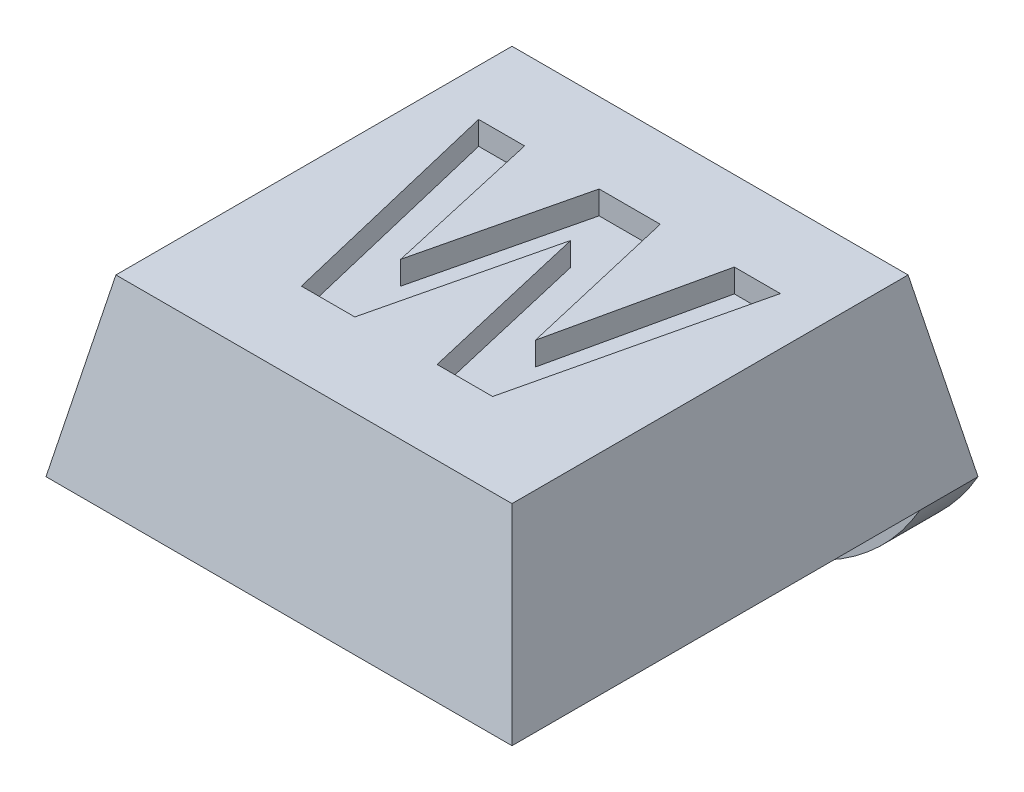
ISO-10303-21;
HEADER;
FILE_DESCRIPTION(('STEP AP214'),'2;1');
FILE_NAME('part.step','',(''),(''),'','','');
FILE_SCHEMA(('AUTOMOTIVE_DESIGN { 1 0 10303 214 1 1 1 1 }'));
ENDSEC;
DATA;
#1=APPLICATION_CONTEXT('core data for automotive mechanical design processes');
#2=APPLICATION_PROTOCOL_DEFINITION('international standard','automotive_design',2000,#1);
#3=PRODUCT_CONTEXT('',#1,'mechanical');
#4=PRODUCT('Part','Part','',(#3));
#5=PRODUCT_RELATED_PRODUCT_CATEGORY('part','',(#4));
#6=PRODUCT_DEFINITION_FORMATION('','',#4);
#7=PRODUCT_DEFINITION_CONTEXT('part definition',#1,'design');
#8=PRODUCT_DEFINITION('design','',#6,#7);
#9=PRODUCT_DEFINITION_SHAPE('','',#8);
#10=(LENGTH_UNIT() NAMED_UNIT(*) SI_UNIT(.MILLI.,.METRE.));
#11=(NAMED_UNIT(*) PLANE_ANGLE_UNIT() SI_UNIT($,.RADIAN.));
#12=(NAMED_UNIT(*) SI_UNIT($,.STERADIAN.) SOLID_ANGLE_UNIT());
#13=UNCERTAINTY_MEASURE_WITH_UNIT(LENGTH_MEASURE(1.E-05),#10,'distance_accuracy_value','');
#14=(GEOMETRIC_REPRESENTATION_CONTEXT(3) GLOBAL_UNCERTAINTY_ASSIGNED_CONTEXT((#13)) GLOBAL_UNIT_ASSIGNED_CONTEXT((#10,
#11,#12)) REPRESENTATION_CONTEXT('',''));
#15=CARTESIAN_POINT('',(0.,0.,0.));
#16=DIRECTION('',(0.,0.,1.));
#17=DIRECTION('',(1.,0.,0.));
#18=AXIS2_PLACEMENT_3D('',#15,#16,#17);
#19=CARTESIAN_POINT('',(0.,3.,0.));
#20=DIRECTION('',(0.,-1.,0.));
#21=DIRECTION('',(0.,0.,-1.));
#22=AXIS2_PLACEMENT_3D('',#19,#20,#21);
#23=PLANE('',#22);
#24=DIRECTION('',(-1.,0.,0.));
#25=VECTOR('',#24,1.);
#26=CARTESIAN_POINT('',(11.,3.,-0.6));
#27=LINE('',#26,#25);
#28=CARTESIAN_POINT('',(7.4,3.,-0.6));
#29=VERTEX_POINT('',#28);
#30=CARTESIAN_POINT('',(0.6,3.,-0.6));
#31=VERTEX_POINT('',#30);
#32=EDGE_CURVE('E235',#29,#31,#27,.T.);
#33=ORIENTED_EDGE('',*,*,#32,.F.);
#34=DIRECTION('',(0.,0.,1.));
#35=VECTOR('',#34,1.);
#36=CARTESIAN_POINT('',(7.4,3.,-8.));
#37=LINE('',#36,#35);
#38=CARTESIAN_POINT('',(7.4,3.,-7.4));
#39=VERTEX_POINT('',#38);
#40=EDGE_CURVE('E248',#39,#29,#37,.T.);
#41=ORIENTED_EDGE('',*,*,#40,.F.);
#42=DIRECTION('',(-1.,0.,0.));
#43=VECTOR('',#42,1.);
#44=CARTESIAN_POINT('',(11.,3.,-7.4));
#45=LINE('',#44,#43);
#46=CARTESIAN_POINT('',(0.599999999999999,3.,-7.4));
#47=VERTEX_POINT('',#46);
#48=EDGE_CURVE('E231',#39,#47,#45,.T.);
#49=ORIENTED_EDGE('',*,*,#48,.T.);
#50=DIRECTION('',(0.,0.,1.));
#51=VECTOR('',#50,1.);
#52=CARTESIAN_POINT('',(0.6,3.,-8.));
#53=LINE('',#52,#51);
#54=EDGE_CURVE('E251',#47,#31,#53,.T.);
#55=ORIENTED_EDGE('',*,*,#54,.T.);
#56=EDGE_LOOP('',(#33,#41,#49,#55));
#57=FACE_BOUND('',#56,.T.);
#58=DIRECTION('',(-1.,0.,0.));
#59=VECTOR('',#58,1.);
#60=CARTESIAN_POINT('',(3.27563446302178,3.,-2.02598897103474));
#61=LINE('',#60,#59);
#62=CARTESIAN_POINT('',(3.27563446302178,3.,-2.02598897103474));
#63=VERTEX_POINT('',#62);
#64=CARTESIAN_POINT('',(2.35896779635511,3.,-2.02598897103474));
#65=VERTEX_POINT('',#64);
#66=EDGE_CURVE('E58',#63,#65,#61,.T.);
#67=ORIENTED_EDGE('',*,*,#66,.T.);
#68=DIRECTION('',(-0.232805557977594,0.,-0.972523301610168));
#69=VECTOR('',#68,1.);
#70=CARTESIAN_POINT('',(2.35896779635511,3.,-2.02598897103474));
#71=LINE('',#70,#69);
#72=CARTESIAN_POINT('',(1.40143574507306,3.,-6.02598897103474));
#73=VERTEX_POINT('',#72);
#74=EDGE_CURVE('E203',#65,#73,#71,.T.);
#75=ORIENTED_EDGE('',*,*,#74,.T.);
#76=DIRECTION('',(1.,0.,0.));
#77=VECTOR('',#76,1.);
#78=CARTESIAN_POINT('',(1.40143574507306,3.,-6.02598897103474));
#79=LINE('',#78,#77);
#80=CARTESIAN_POINT('',(2.1898972835346,3.,-6.02598897103474));
#81=VERTEX_POINT('',#80);
#82=EDGE_CURVE('E687',#73,#81,#79,.T.);
#83=ORIENTED_EDGE('',*,*,#82,.T.);
#84=DIRECTION('',(0.220723550534742,0.,0.975336410803645));
#85=VECTOR('',#84,1.);
#86=CARTESIAN_POINT('',(2.1898972835346,3.,-6.02598897103474));
#87=LINE('',#86,#85);
#88=CARTESIAN_POINT('',(2.81169215532947,3.,-3.27839281718859));
#89=VERTEX_POINT('',#88);
#90=EDGE_CURVE('E689',#81,#89,#87,.T.);
#91=ORIENTED_EDGE('',*,*,#90,.T.);
#92=DIRECTION('',(0.232847309499335,0.,-0.972513306057516));
#93=VECTOR('',#92,1.);
#94=CARTESIAN_POINT('',(2.81169215532947,3.,-3.27839281718859));
#95=LINE('',#94,#93);
#96=CARTESIAN_POINT('',(3.46954471943203,3.,-6.02598897103474));
#97=VERTEX_POINT('',#96);
#98=EDGE_CURVE('E694',#89,#97,#95,.T.);
#99=ORIENTED_EDGE('',*,*,#98,.T.);
#100=DIRECTION('',(1.,0.,0.));
#101=VECTOR('',#100,1.);
#102=CARTESIAN_POINT('',(3.46954471943203,3.,-6.02598897103474));
#103=LINE('',#102,#101);
#104=CARTESIAN_POINT('',(4.51922420661152,3.,-6.02598897103474));
#105=VERTEX_POINT('',#104);
#106=EDGE_CURVE('E704',#97,#105,#103,.T.);
#107=ORIENTED_EDGE('',*,*,#106,.T.);
#108=DIRECTION('',(0.227061862326247,0.,0.973880336939265));
#109=VECTOR('',#108,1.);
#110=CARTESIAN_POINT('',(4.51922420661152,3.,-6.02598897103474));
#111=LINE('',#110,#109);
#112=CARTESIAN_POINT('',(5.17066651430383,3.,-3.23191845821423));
#113=VERTEX_POINT('',#112);
#114=EDGE_CURVE('E708',#105,#113,#111,.T.);
#115=ORIENTED_EDGE('',*,*,#114,.T.);
#116=DIRECTION('',(0.21669330416257,0.,-0.976239730768579));
#117=VECTOR('',#116,1.);
#118=CARTESIAN_POINT('',(5.17066651430383,3.,-3.23191845821423));
#119=LINE('',#118,#117);
#120=CARTESIAN_POINT('',(5.79085882199614,3.,-6.02598897103474));
#121=VERTEX_POINT('',#120);
#122=EDGE_CURVE('E712',#113,#121,#119,.T.);
#123=ORIENTED_EDGE('',*,*,#122,.T.);
#124=DIRECTION('',(1.,0.,0.));
#125=VECTOR('',#124,1.);
#126=CARTESIAN_POINT('',(5.79085882199614,3.,-6.02598897103474));
#127=LINE('',#126,#125);
#128=CARTESIAN_POINT('',(6.58092292456024,3.,-6.02598897103474));
#129=VERTEX_POINT('',#128);
#130=EDGE_CURVE('E716',#121,#129,#127,.T.);
#131=ORIENTED_EDGE('',*,*,#130,.T.);
#132=DIRECTION('',(-0.228745850379276,0.,0.973486176550167));
#133=VECTOR('',#132,1.);
#134=CARTESIAN_POINT('',(6.58092292456024,3.,-6.02598897103474));
#135=LINE('',#134,#133);
#136=CARTESIAN_POINT('',(5.64101907840639,3.,-2.02598897103474));
#137=VERTEX_POINT('',#136);
#138=EDGE_CURVE('E650',#129,#137,#135,.T.);
#139=ORIENTED_EDGE('',*,*,#138,.T.);
#140=DIRECTION('',(-1.,0.,0.));
#141=VECTOR('',#140,1.);
#142=CARTESIAN_POINT('',(5.64101907840639,3.,-2.02598897103474));
#143=LINE('',#142,#141);
#144=CARTESIAN_POINT('',(4.68829471943203,3.,-2.02598897103474));
#145=VERTEX_POINT('',#144);
#146=EDGE_CURVE('E645',#137,#145,#143,.T.);
#147=ORIENTED_EDGE('',*,*,#146,.T.);
#148=DIRECTION('',(-0.227031625408111,0.,-0.973887386233414));
#149=VECTOR('',#148,1.);
#150=CARTESIAN_POINT('',(4.68829471943203,3.,-2.02598897103474));
#151=LINE('',#150,#149);
#152=CARTESIAN_POINT('',(3.99117933481665,3.,-5.01637358641936));
#153=VERTEX_POINT('',#152);
#154=EDGE_CURVE('E639',#145,#153,#151,.T.);
#155=ORIENTED_EDGE('',*,*,#154,.T.);
#156=DIRECTION('',(-0.232712537268101,0.,0.972545564484381));
#157=VECTOR('',#156,1.);
#158=CARTESIAN_POINT('',(3.99117933481665,3.,-5.01637358641936));
#159=LINE('',#158,#157);
#160=EDGE_CURVE('E199',#153,#63,#159,.T.);
#161=ORIENTED_EDGE('',*,*,#160,.T.);
#162=EDGE_LOOP('',(#67,#75,#83,#91,#99,#107,#115,#123,#131,#139,#147,#155,#161));
#163=FACE_BOUND('',#162,.T.);
#164=ADVANCED_FACE('F42',(#57,#163),#23,.F.);
#165=CARTESIAN_POINT('',(8.,0.,-8.));
#166=DIRECTION('',(-0.98058067569092,-0.196116135138184,0.));
#167=DIRECTION('',(0.196116135138184,-0.98058067569092,0.));
#168=AXIS2_PLACEMENT_3D('',#165,#166,#167);
#169=PLANE('',#168);
#170=DIRECTION('',(-0.192450089729875,0.962250448649376,-0.192450089729875));
#171=VECTOR('',#170,1.);
#172=CARTESIAN_POINT('',(7.7037037037037,1.48148148148148,-0.296296296296296));
#173=LINE('',#172,#171);
#174=CARTESIAN_POINT('',(8.,0.,0.));
#175=VERTEX_POINT('',#174);
#176=EDGE_CURVE('E245',#175,#29,#173,.T.);
#177=ORIENTED_EDGE('',*,*,#176,.F.);
#178=DIRECTION('',(0.,0.,-1.));
#179=VECTOR('',#178,1.);
#180=CARTESIAN_POINT('',(8.,0.,0.));
#181=LINE('',#180,#179);
#182=CARTESIAN_POINT('',(8.,0.,-7.));
#183=VERTEX_POINT('',#182);
#184=EDGE_CURVE('E264',#175,#183,#181,.T.);
#185=ORIENTED_EDGE('',*,*,#184,.T.);
#186=DIRECTION('',(0.,0.,1.));
#187=VECTOR('',#186,1.);
#188=CARTESIAN_POINT('',(8.,0.,-8.));
#189=LINE('',#188,#187);
#190=CARTESIAN_POINT('',(8.,0.,-8.));
#191=VERTEX_POINT('',#190);
#192=EDGE_CURVE('E205',#191,#183,#189,.T.);
#193=ORIENTED_EDGE('',*,*,#192,.F.);
#194=DIRECTION('',(0.192450089729875,-0.962250448649376,-0.192450089729875));
#195=VECTOR('',#194,1.);
#196=CARTESIAN_POINT('',(8.,0.,-8.));
#197=LINE('',#196,#195);
#198=EDGE_CURVE('E238',#39,#191,#197,.T.);
#199=ORIENTED_EDGE('',*,*,#198,.F.);
#200=ORIENTED_EDGE('',*,*,#40,.T.);
#201=EDGE_LOOP('',(#177,#185,#193,#199,#200));
#202=FACE_BOUND('',#201,.T.);
#203=ADVANCED_FACE('F332',(#202),#169,.F.);
#204=CARTESIAN_POINT('',(0.,0.,-8.));
#205=DIRECTION('',(0.98058067569092,-0.196116135138184,0.));
#206=DIRECTION('',(0.196116135138184,0.98058067569092,0.));
#207=AXIS2_PLACEMENT_3D('',#204,#205,#206);
#208=PLANE('',#207);
#209=DIRECTION('',(-0.192450089729875,-0.962250448649376,0.192450089729875));
#210=VECTOR('',#209,1.);
#211=CARTESIAN_POINT('',(0.296296296296296,1.48148148148148,-0.296296296296296));
#212=LINE('',#211,#210);
#213=CARTESIAN_POINT('',(0.,0.,0.));
#214=VERTEX_POINT('',#213);
#215=EDGE_CURVE('E292',#31,#214,#212,.T.);
#216=ORIENTED_EDGE('',*,*,#215,.F.);
#217=ORIENTED_EDGE('',*,*,#54,.F.);
#218=DIRECTION('',(0.192450089729875,0.962250448649376,0.192450089729875));
#219=VECTOR('',#218,1.);
#220=CARTESIAN_POINT('',(0.,0.,-8.));
#221=LINE('',#220,#219);
#222=CARTESIAN_POINT('',(0.,0.,-8.));
#223=VERTEX_POINT('',#222);
#224=EDGE_CURVE('E263',#223,#47,#221,.T.);
#225=ORIENTED_EDGE('',*,*,#224,.F.);
#226=DIRECTION('',(0.,0.,1.));
#227=VECTOR('',#226,1.);
#228=CARTESIAN_POINT('',(0.,0.,0.));
#229=LINE('',#228,#227);
#230=CARTESIAN_POINT('',(0.,0.,-7.));
#231=VERTEX_POINT('',#230);
#232=EDGE_CURVE('E268',#223,#231,#229,.T.);
#233=ORIENTED_EDGE('',*,*,#232,.T.);
#234=EDGE_CURVE('E255',#231,#214,#229,.T.);
#235=ORIENTED_EDGE('',*,*,#234,.T.);
#236=EDGE_LOOP('',(#216,#217,#225,#233,#235));
#237=FACE_BOUND('',#236,.T.);
#238=ADVANCED_FACE('F316',(#237),#208,.F.);
#239=CARTESIAN_POINT('',(0.,0.,0.));
#240=DIRECTION('',(0.,-1.,0.));
#241=DIRECTION('',(0.,0.,-1.));
#242=AXIS2_PLACEMENT_3D('',#239,#240,#241);
#243=PLANE('',#242);
#244=DIRECTION('',(-1.,0.,0.));
#245=VECTOR('',#244,1.);
#246=CARTESIAN_POINT('',(0.,0.,-7.));
#247=LINE('',#246,#245);
#248=EDGE_CURVE('E211',#183,#231,#247,.T.);
#249=ORIENTED_EDGE('',*,*,#248,.F.);
#250=ORIENTED_EDGE('',*,*,#184,.F.);
#251=DIRECTION('',(1.,0.,0.));
#252=VECTOR('',#251,1.);
#253=CARTESIAN_POINT('',(0.,0.,0.));
#254=LINE('',#253,#252);
#255=EDGE_CURVE('E265',#214,#175,#254,.T.);
#256=ORIENTED_EDGE('',*,*,#255,.F.);
#257=ORIENTED_EDGE('',*,*,#234,.F.);
#258=EDGE_LOOP('',(#249,#250,#256,#257));
#259=FACE_BOUND('',#258,.T.);
#260=CARTESIAN_POINT('',(4.,0.,-3.75));
#261=DIRECTION('',(0.,-1.,0.));
#262=DIRECTION('',(0.,0.,-1.));
#263=AXIS2_PLACEMENT_3D('',#260,#261,#262);
#264=CIRCLE('',#263,1.8);
#265=CARTESIAN_POINT('',(4.,0.,-5.55));
#266=VERTEX_POINT('',#265);
#267=EDGE_CURVE('E223',#266,#266,#264,.T.);
#268=ORIENTED_EDGE('',*,*,#267,.F.);
#269=EDGE_LOOP('',(#268));
#270=FACE_BOUND('',#269,.T.);
#271=ADVANCED_FACE('F327',(#259,#270),#243,.T.);
#272=CARTESIAN_POINT('',(11.,3.,-7.4));
#273=DIRECTION('',(0.,0.196116135138184,-0.98058067569092));
#274=DIRECTION('',(0.,0.98058067569092,0.196116135138184));
#275=AXIS2_PLACEMENT_3D('',#272,#273,#274);
#276=PLANE('',#275);
#277=ORIENTED_EDGE('',*,*,#198,.T.);
#278=DIRECTION('',(-1.,0.,0.));
#279=VECTOR('',#278,1.);
#280=CARTESIAN_POINT('',(0.,0.,-8.));
#281=LINE('',#280,#279);
#282=EDGE_CURVE('E259',#191,#223,#281,.T.);
#283=ORIENTED_EDGE('',*,*,#282,.T.);
#284=ORIENTED_EDGE('',*,*,#224,.T.);
#285=ORIENTED_EDGE('',*,*,#48,.F.);
#286=EDGE_LOOP('',(#277,#283,#284,#285));
#287=FACE_BOUND('',#286,.T.);
#288=ADVANCED_FACE('F311',(#287),#276,.T.);
#289=CARTESIAN_POINT('',(11.,0.,0.));
#290=DIRECTION('',(0.,0.196116135138184,0.98058067569092));
#291=DIRECTION('',(0.,-0.98058067569092,0.196116135138184));
#292=AXIS2_PLACEMENT_3D('',#289,#290,#291);
#293=PLANE('',#292);
#294=ORIENTED_EDGE('',*,*,#176,.T.);
#295=ORIENTED_EDGE('',*,*,#32,.T.);
#296=ORIENTED_EDGE('',*,*,#215,.T.);
#297=ORIENTED_EDGE('',*,*,#255,.T.);
#298=EDGE_LOOP('',(#294,#295,#296,#297));
#299=FACE_BOUND('',#298,.T.);
#300=ADVANCED_FACE('F358',(#299),#293,.T.);
#301=CARTESIAN_POINT('',(4.,0.8,-3.75));
#302=DIRECTION('',(0.,-1.,0.));
#303=DIRECTION('',(0.,0.,-1.));
#304=AXIS2_PLACEMENT_3D('',#301,#302,#303);
#305=CYLINDRICAL_SURFACE('',#304,1.8);
#306=CARTESIAN_POINT('',(4.,0.8,-3.75));
#307=DIRECTION('',(0.,-1.,0.));
#308=DIRECTION('',(0.,0.,-1.));
#309=AXIS2_PLACEMENT_3D('',#306,#307,#308);
#310=CIRCLE('',#309,1.8);
#311=CARTESIAN_POINT('',(4.,0.8,-5.55));
#312=VERTEX_POINT('',#311);
#313=EDGE_CURVE('E227',#312,#312,#310,.T.);
#314=ORIENTED_EDGE('',*,*,#313,.F.);
#315=EDGE_LOOP('',(#314));
#316=FACE_BOUND('',#315,.T.);
#317=ORIENTED_EDGE('',*,*,#267,.T.);
#318=EDGE_LOOP('',(#317));
#319=FACE_BOUND('',#318,.T.);
#320=ADVANCED_FACE('F365',(#316,#319),#305,.F.);
#321=CARTESIAN_POINT('',(4.,0.8,-3.75));
#322=DIRECTION('',(0.,-1.,0.));
#323=DIRECTION('',(0.,0.,-1.));
#324=AXIS2_PLACEMENT_3D('',#321,#322,#323);
#325=PLANE('',#324);
#326=ORIENTED_EDGE('',*,*,#313,.T.);
#327=EDGE_LOOP('',(#326));
#328=FACE_BOUND('',#327,.T.);
#329=ADVANCED_FACE('F369',(#328),#325,.T.);
#330=CARTESIAN_POINT('',(0.,-2.,-8.));
#331=DIRECTION('',(0.,0.,1.));
#332=DIRECTION('',(1.,0.,0.));
#333=AXIS2_PLACEMENT_3D('',#330,#331,#332);
#334=PLANE('',#333);
#335=ORIENTED_EDGE('',*,*,#282,.F.);
#336=CARTESIAN_POINT('',(4.53589838486225,2.,-8.));
#337=DIRECTION('',(0.,0.,1.));
#338=DIRECTION('',(1.,0.,0.));
#339=AXIS2_PLACEMENT_3D('',#336,#337,#338);
#340=CIRCLE('',#339,4.);
#341=CARTESIAN_POINT('',(4.53589838486225,-2.,-8.));
#342=VERTEX_POINT('',#341);
#343=EDGE_CURVE('E11',#191,#342,#340,.F.);
#344=ORIENTED_EDGE('',*,*,#343,.T.);
#345=DIRECTION('',(1.,0.,0.));
#346=VECTOR('',#345,1.);
#347=CARTESIAN_POINT('',(0.,-2.,-8.));
#348=LINE('',#347,#346);
#349=CARTESIAN_POINT('',(3.46410161513775,-2.,-8.));
#350=VERTEX_POINT('',#349);
#351=EDGE_CURVE('E217',#350,#342,#348,.T.);
#352=ORIENTED_EDGE('',*,*,#351,.F.);
#353=CARTESIAN_POINT('',(3.46410161513775,2.,-8.));
#354=DIRECTION('',(0.,0.,1.));
#355=DIRECTION('',(1.,0.,0.));
#356=AXIS2_PLACEMENT_3D('',#353,#354,#355);
#357=CIRCLE('',#356,4.);
#358=EDGE_CURVE('E51',#350,#223,#357,.F.);
#359=ORIENTED_EDGE('',*,*,#358,.T.);
#360=EDGE_LOOP('',(#335,#344,#352,#359));
#361=FACE_BOUND('',#360,.T.);
#362=ADVANCED_FACE('F304',(#361),#334,.F.);
#363=CARTESIAN_POINT('',(0.,-2.,-7.));
#364=DIRECTION('',(0.,0.,-1.));
#365=DIRECTION('',(-1.,0.,0.));
#366=AXIS2_PLACEMENT_3D('',#363,#364,#365);
#367=PLANE('',#366);
#368=DIRECTION('',(-1.,0.,0.));
#369=VECTOR('',#368,1.);
#370=CARTESIAN_POINT('',(0.,-2.,-7.));
#371=LINE('',#370,#369);
#372=CARTESIAN_POINT('',(4.53589838486225,-2.,-7.));
#373=VERTEX_POINT('',#372);
#374=CARTESIAN_POINT('',(3.46410161513775,-2.,-7.));
#375=VERTEX_POINT('',#374);
#376=EDGE_CURVE('E221',#373,#375,#371,.T.);
#377=ORIENTED_EDGE('',*,*,#376,.F.);
#378=CARTESIAN_POINT('',(4.53589838486225,2.,-7.));
#379=DIRECTION('',(0.,0.,-1.));
#380=DIRECTION('',(-1.,0.,0.));
#381=AXIS2_PLACEMENT_3D('',#378,#379,#380);
#382=CIRCLE('',#381,4.);
#383=EDGE_CURVE('E298',#373,#183,#382,.F.);
#384=ORIENTED_EDGE('',*,*,#383,.T.);
#385=ORIENTED_EDGE('',*,*,#248,.T.);
#386=CARTESIAN_POINT('',(3.46410161513775,2.,-7.));
#387=DIRECTION('',(0.,0.,-1.));
#388=DIRECTION('',(-1.,0.,0.));
#389=AXIS2_PLACEMENT_3D('',#386,#387,#388);
#390=CIRCLE('',#389,4.);
#391=EDGE_CURVE('E66',#231,#375,#390,.F.);
#392=ORIENTED_EDGE('',*,*,#391,.T.);
#393=EDGE_LOOP('',(#377,#384,#385,#392));
#394=FACE_BOUND('',#393,.T.);
#395=ADVANCED_FACE('F322',(#394),#367,.F.);
#396=CARTESIAN_POINT('',(0.,-2.,0.));
#397=DIRECTION('',(0.,1.,0.));
#398=DIRECTION('',(0.,0.,1.));
#399=AXIS2_PLACEMENT_3D('',#396,#397,#398);
#400=PLANE('',#399);
#401=ORIENTED_EDGE('',*,*,#351,.T.);
#402=DIRECTION('',(0.,0.,1.));
#403=VECTOR('',#402,1.);
#404=CARTESIAN_POINT('',(4.53589838486225,-2.,0.));
#405=LINE('',#404,#403);
#406=EDGE_CURVE('E291',#342,#373,#405,.T.);
#407=ORIENTED_EDGE('',*,*,#406,.T.);
#408=ORIENTED_EDGE('',*,*,#376,.T.);
#409=DIRECTION('',(0.,0.,-1.));
#410=VECTOR('',#409,1.);
#411=CARTESIAN_POINT('',(3.46410161513775,-2.,0.));
#412=LINE('',#411,#410);
#413=EDGE_CURVE('E287',#375,#350,#412,.T.);
#414=ORIENTED_EDGE('',*,*,#413,.T.);
#415=EDGE_LOOP('',(#401,#407,#408,#414));
#416=FACE_BOUND('',#415,.T.);
#417=ADVANCED_FACE('F320',(#416),#400,.F.);
#418=CARTESIAN_POINT('',(4.53589838486225,2.,-8.));
#419=DIRECTION('',(0.,0.,1.));
#420=DIRECTION('',(1.,0.,0.));
#421=AXIS2_PLACEMENT_3D('',#418,#419,#420);
#422=CYLINDRICAL_SURFACE('',#421,4.);
#423=ORIENTED_EDGE('',*,*,#343,.F.);
#424=ORIENTED_EDGE('',*,*,#192,.T.);
#425=ORIENTED_EDGE('',*,*,#383,.F.);
#426=ORIENTED_EDGE('',*,*,#406,.F.);
#427=EDGE_LOOP('',(#423,#424,#425,#426));
#428=FACE_BOUND('',#427,.T.);
#429=ADVANCED_FACE('F333',(#428),#422,.T.);
#430=CARTESIAN_POINT('',(3.46410161513775,2.,-8.));
#431=DIRECTION('',(0.,0.,-1.));
#432=DIRECTION('',(-1.,0.,0.));
#433=AXIS2_PLACEMENT_3D('',#430,#431,#432);
#434=CYLINDRICAL_SURFACE('',#433,4.);
#435=ORIENTED_EDGE('',*,*,#391,.F.);
#436=ORIENTED_EDGE('',*,*,#232,.F.);
#437=ORIENTED_EDGE('',*,*,#358,.F.);
#438=ORIENTED_EDGE('',*,*,#413,.F.);
#439=EDGE_LOOP('',(#435,#436,#437,#438));
#440=FACE_BOUND('',#439,.T.);
#441=ADVANCED_FACE('F44',(#440),#434,.T.);
#442=CARTESIAN_POINT('',(3.27563446302178,2.6,-2.02598897103474));
#443=DIRECTION('',(0.,0.,-1.));
#444=DIRECTION('',(-1.,0.,0.));
#445=AXIS2_PLACEMENT_3D('',#442,#443,#444);
#446=PLANE('',#445);
#447=ORIENTED_EDGE('',*,*,#66,.F.);
#448=DIRECTION('',(0.,1.,0.));
#449=VECTOR('',#448,1.);
#450=CARTESIAN_POINT('',(3.27563446302178,2.6,-2.02598897103474));
#451=LINE('',#450,#449);
#452=CARTESIAN_POINT('',(3.27563446302178,2.6,-2.02598897103474));
#453=VERTEX_POINT('',#452);
#454=EDGE_CURVE('E197',#453,#63,#451,.T.);
#455=ORIENTED_EDGE('',*,*,#454,.F.);
#456=DIRECTION('',(-1.,0.,0.));
#457=VECTOR('',#456,1.);
#458=CARTESIAN_POINT('',(3.27563446302178,2.6,-2.02598897103474));
#459=LINE('',#458,#457);
#460=CARTESIAN_POINT('',(2.35896779635511,2.6,-2.02598897103474));
#461=VERTEX_POINT('',#460);
#462=EDGE_CURVE('E187',#453,#461,#459,.T.);
#463=ORIENTED_EDGE('',*,*,#462,.T.);
#464=DIRECTION('',(0.,1.,0.));
#465=VECTOR('',#464,1.);
#466=CARTESIAN_POINT('',(2.35896779635511,2.6,-2.02598897103474));
#467=LINE('',#466,#465);
#468=EDGE_CURVE('E196',#461,#65,#467,.T.);
#469=ORIENTED_EDGE('',*,*,#468,.T.);
#470=EDGE_LOOP('',(#447,#455,#463,#469));
#471=FACE_BOUND('',#470,.T.);
#472=ADVANCED_FACE('F195',(#471),#446,.T.);
#473=CARTESIAN_POINT('',(2.35896779635511,2.6,-2.02598897103474));
#474=DIRECTION('',(0.972523301610168,0.,-0.232805557977594));
#475=DIRECTION('',(-0.232805557977594,0.,-0.972523301610168));
#476=AXIS2_PLACEMENT_3D('',#473,#474,#475);
#477=PLANE('',#476);
#478=ORIENTED_EDGE('',*,*,#74,.F.);
#479=ORIENTED_EDGE('',*,*,#468,.F.);
#480=DIRECTION('',(-0.232805557977594,0.,-0.972523301610168));
#481=VECTOR('',#480,1.);
#482=CARTESIAN_POINT('',(2.35896779635511,2.6,-2.02598897103474));
#483=LINE('',#482,#481);
#484=CARTESIAN_POINT('',(1.40143574507306,2.6,-6.02598897103474));
#485=VERTEX_POINT('',#484);
#486=EDGE_CURVE('E183',#461,#485,#483,.T.);
#487=ORIENTED_EDGE('',*,*,#486,.T.);
#488=DIRECTION('',(0.,1.,0.));
#489=VECTOR('',#488,1.);
#490=CARTESIAN_POINT('',(1.40143574507306,2.6,-6.02598897103474));
#491=LINE('',#490,#489);
#492=EDGE_CURVE('E206',#485,#73,#491,.T.);
#493=ORIENTED_EDGE('',*,*,#492,.T.);
#494=EDGE_LOOP('',(#478,#479,#487,#493));
#495=FACE_BOUND('',#494,.T.);
#496=ADVANCED_FACE('F201',(#495),#477,.T.);
#497=CARTESIAN_POINT('',(1.40143574507306,2.6,-6.02598897103474));
#498=DIRECTION('',(0.,0.,1.));
#499=DIRECTION('',(1.,0.,0.));
#500=AXIS2_PLACEMENT_3D('',#497,#498,#499);
#501=PLANE('',#500);
#502=ORIENTED_EDGE('',*,*,#82,.F.);
#503=ORIENTED_EDGE('',*,*,#492,.F.);
#504=DIRECTION('',(1.,0.,0.));
#505=VECTOR('',#504,1.);
#506=CARTESIAN_POINT('',(1.40143574507306,2.6,-6.02598897103474));
#507=LINE('',#506,#505);
#508=CARTESIAN_POINT('',(2.1898972835346,2.6,-6.02598897103474));
#509=VERTEX_POINT('',#508);
#510=EDGE_CURVE('E189',#485,#509,#507,.T.);
#511=ORIENTED_EDGE('',*,*,#510,.T.);
#512=DIRECTION('',(0.,1.,0.));
#513=VECTOR('',#512,1.);
#514=CARTESIAN_POINT('',(2.1898972835346,2.6,-6.02598897103474));
#515=LINE('',#514,#513);
#516=EDGE_CURVE('E213',#509,#81,#515,.T.);
#517=ORIENTED_EDGE('',*,*,#516,.T.);
#518=EDGE_LOOP('',(#502,#503,#511,#517));
#519=FACE_BOUND('',#518,.T.);
#520=ADVANCED_FACE('F382',(#519),#501,.T.);
#521=CARTESIAN_POINT('',(2.1898972835346,2.6,-6.02598897103474));
#522=DIRECTION('',(-0.975336410803646,0.,0.220723550534742));
#523=DIRECTION('',(0.220723550534742,0.,0.975336410803646));
#524=AXIS2_PLACEMENT_3D('',#521,#522,#523);
#525=PLANE('',#524);
#526=ORIENTED_EDGE('',*,*,#90,.F.);
#527=ORIENTED_EDGE('',*,*,#516,.F.);
#528=DIRECTION('',(0.220723550534742,0.,0.975336410803645));
#529=VECTOR('',#528,1.);
#530=CARTESIAN_POINT('',(2.1898972835346,2.6,-6.02598897103474));
#531=LINE('',#530,#529);
#532=CARTESIAN_POINT('',(2.81169215532947,2.6,-3.27839281718859));
#533=VERTEX_POINT('',#532);
#534=EDGE_CURVE('E755',#509,#533,#531,.T.);
#535=ORIENTED_EDGE('',*,*,#534,.T.);
#536=DIRECTION('',(0.,1.,0.));
#537=VECTOR('',#536,1.);
#538=CARTESIAN_POINT('',(2.81169215532947,2.6,-3.27839281718859));
#539=LINE('',#538,#537);
#540=EDGE_CURVE('E680',#533,#89,#539,.T.);
#541=ORIENTED_EDGE('',*,*,#540,.T.);
#542=EDGE_LOOP('',(#526,#527,#535,#541));
#543=FACE_BOUND('',#542,.T.);
#544=ADVANCED_FACE('F385',(#543),#525,.T.);
#545=CARTESIAN_POINT('',(2.81169215532947,2.6,-3.27839281718859));
#546=DIRECTION('',(0.972513306057516,0.,0.232847309499335));
#547=DIRECTION('',(0.232847309499335,0.,-0.972513306057517));
#548=AXIS2_PLACEMENT_3D('',#545,#546,#547);
#549=PLANE('',#548);
#550=ORIENTED_EDGE('',*,*,#98,.F.);
#551=ORIENTED_EDGE('',*,*,#540,.F.);
#552=DIRECTION('',(0.232847309499335,0.,-0.972513306057516));
#553=VECTOR('',#552,1.);
#554=CARTESIAN_POINT('',(2.81169215532947,2.6,-3.27839281718859));
#555=LINE('',#554,#553);
#556=CARTESIAN_POINT('',(3.46954471943203,2.6,-6.02598897103474));
#557=VERTEX_POINT('',#556);
#558=EDGE_CURVE('E752',#533,#557,#555,.T.);
#559=ORIENTED_EDGE('',*,*,#558,.T.);
#560=DIRECTION('',(0.,1.,0.));
#561=VECTOR('',#560,1.);
#562=CARTESIAN_POINT('',(3.46954471943203,2.6,-6.02598897103474));
#563=LINE('',#562,#561);
#564=EDGE_CURVE('E677',#557,#97,#563,.T.);
#565=ORIENTED_EDGE('',*,*,#564,.T.);
#566=EDGE_LOOP('',(#550,#551,#559,#565));
#567=FACE_BOUND('',#566,.T.);
#568=ADVANCED_FACE('F389',(#567),#549,.T.);
#569=CARTESIAN_POINT('',(3.46954471943203,2.6,-6.02598897103474));
#570=DIRECTION('',(0.,0.,1.));
#571=DIRECTION('',(1.,0.,0.));
#572=AXIS2_PLACEMENT_3D('',#569,#570,#571);
#573=PLANE('',#572);
#574=ORIENTED_EDGE('',*,*,#106,.F.);
#575=ORIENTED_EDGE('',*,*,#564,.F.);
#576=DIRECTION('',(1.,0.,0.));
#577=VECTOR('',#576,1.);
#578=CARTESIAN_POINT('',(3.46954471943203,2.6,-6.02598897103474));
#579=LINE('',#578,#577);
#580=CARTESIAN_POINT('',(4.51922420661152,2.6,-6.02598897103474));
#581=VERTEX_POINT('',#580);
#582=EDGE_CURVE('E749',#557,#581,#579,.T.);
#583=ORIENTED_EDGE('',*,*,#582,.T.);
#584=DIRECTION('',(0.,1.,0.));
#585=VECTOR('',#584,1.);
#586=CARTESIAN_POINT('',(4.51922420661152,2.6,-6.02598897103474));
#587=LINE('',#586,#585);
#588=EDGE_CURVE('E674',#581,#105,#587,.T.);
#589=ORIENTED_EDGE('',*,*,#588,.T.);
#590=EDGE_LOOP('',(#574,#575,#583,#589));
#591=FACE_BOUND('',#590,.T.);
#592=ADVANCED_FACE('F393',(#591),#573,.T.);
#593=CARTESIAN_POINT('',(4.51922420661152,2.6,-6.02598897103474));
#594=DIRECTION('',(-0.973880336939265,0.,0.227061862326247));
#595=DIRECTION('',(0.227061862326247,0.,0.973880336939265));
#596=AXIS2_PLACEMENT_3D('',#593,#594,#595);
#597=PLANE('',#596);
#598=ORIENTED_EDGE('',*,*,#114,.F.);
#599=ORIENTED_EDGE('',*,*,#588,.F.);
#600=DIRECTION('',(0.227061862326247,0.,0.973880336939265));
#601=VECTOR('',#600,1.);
#602=CARTESIAN_POINT('',(4.51922420661152,2.6,-6.02598897103474));
#603=LINE('',#602,#601);
#604=CARTESIAN_POINT('',(5.17066651430383,2.6,-3.23191845821423));
#605=VERTEX_POINT('',#604);
#606=EDGE_CURVE('E746',#581,#605,#603,.T.);
#607=ORIENTED_EDGE('',*,*,#606,.T.);
#608=DIRECTION('',(0.,1.,0.));
#609=VECTOR('',#608,1.);
#610=CARTESIAN_POINT('',(5.17066651430383,2.6,-3.23191845821423));
#611=LINE('',#610,#609);
#612=EDGE_CURVE('E671',#605,#113,#611,.T.);
#613=ORIENTED_EDGE('',*,*,#612,.T.);
#614=EDGE_LOOP('',(#598,#599,#607,#613));
#615=FACE_BOUND('',#614,.T.);
#616=ADVANCED_FACE('F397',(#615),#597,.T.);
#617=CARTESIAN_POINT('',(5.17066651430383,2.6,-3.23191845821423));
#618=DIRECTION('',(0.976239730768579,0.,0.21669330416257));
#619=DIRECTION('',(0.21669330416257,0.,-0.976239730768579));
#620=AXIS2_PLACEMENT_3D('',#617,#618,#619);
#621=PLANE('',#620);
#622=ORIENTED_EDGE('',*,*,#122,.F.);
#623=ORIENTED_EDGE('',*,*,#612,.F.);
#624=DIRECTION('',(0.21669330416257,0.,-0.976239730768579));
#625=VECTOR('',#624,1.);
#626=CARTESIAN_POINT('',(5.17066651430383,2.6,-3.23191845821423));
#627=LINE('',#626,#625);
#628=CARTESIAN_POINT('',(5.79085882199614,2.6,-6.02598897103474));
#629=VERTEX_POINT('',#628);
#630=EDGE_CURVE('E743',#605,#629,#627,.T.);
#631=ORIENTED_EDGE('',*,*,#630,.T.);
#632=DIRECTION('',(0.,1.,0.));
#633=VECTOR('',#632,1.);
#634=CARTESIAN_POINT('',(5.79085882199614,2.6,-6.02598897103474));
#635=LINE('',#634,#633);
#636=EDGE_CURVE('E668',#629,#121,#635,.T.);
#637=ORIENTED_EDGE('',*,*,#636,.T.);
#638=EDGE_LOOP('',(#622,#623,#631,#637));
#639=FACE_BOUND('',#638,.T.);
#640=ADVANCED_FACE('F401',(#639),#621,.T.);
#641=CARTESIAN_POINT('',(5.79085882199614,2.6,-6.02598897103474));
#642=DIRECTION('',(0.,0.,1.));
#643=DIRECTION('',(1.,0.,0.));
#644=AXIS2_PLACEMENT_3D('',#641,#642,#643);
#645=PLANE('',#644);
#646=ORIENTED_EDGE('',*,*,#130,.F.);
#647=ORIENTED_EDGE('',*,*,#636,.F.);
#648=DIRECTION('',(1.,0.,0.));
#649=VECTOR('',#648,1.);
#650=CARTESIAN_POINT('',(5.79085882199614,2.6,-6.02598897103474));
#651=LINE('',#650,#649);
#652=CARTESIAN_POINT('',(6.58092292456024,2.6,-6.02598897103474));
#653=VERTEX_POINT('',#652);
#654=EDGE_CURVE('E740',#629,#653,#651,.T.);
#655=ORIENTED_EDGE('',*,*,#654,.T.);
#656=DIRECTION('',(0.,1.,0.));
#657=VECTOR('',#656,1.);
#658=CARTESIAN_POINT('',(6.58092292456024,2.6,-6.02598897103474));
#659=LINE('',#658,#657);
#660=EDGE_CURVE('E665',#653,#129,#659,.T.);
#661=ORIENTED_EDGE('',*,*,#660,.T.);
#662=EDGE_LOOP('',(#646,#647,#655,#661));
#663=FACE_BOUND('',#662,.T.);
#664=ADVANCED_FACE('F405',(#663),#645,.T.);
#665=CARTESIAN_POINT('',(6.58092292456024,2.6,-6.02598897103474));
#666=DIRECTION('',(-0.973486176550166,0.,-0.228745850379276));
#667=DIRECTION('',(-0.228745850379276,0.,0.973486176550167));
#668=AXIS2_PLACEMENT_3D('',#665,#666,#667);
#669=PLANE('',#668);
#670=ORIENTED_EDGE('',*,*,#138,.F.);
#671=ORIENTED_EDGE('',*,*,#660,.F.);
#672=DIRECTION('',(-0.228745850379276,0.,0.973486176550167));
#673=VECTOR('',#672,1.);
#674=CARTESIAN_POINT('',(6.58092292456024,2.6,-6.02598897103474));
#675=LINE('',#674,#673);
#676=CARTESIAN_POINT('',(5.64101907840639,2.6,-2.02598897103474));
#677=VERTEX_POINT('',#676);
#678=EDGE_CURVE('E725',#653,#677,#675,.T.);
#679=ORIENTED_EDGE('',*,*,#678,.T.);
#680=DIRECTION('',(0.,1.,0.));
#681=VECTOR('',#680,1.);
#682=CARTESIAN_POINT('',(5.64101907840639,2.6,-2.02598897103474));
#683=LINE('',#682,#681);
#684=EDGE_CURVE('E662',#677,#137,#683,.T.);
#685=ORIENTED_EDGE('',*,*,#684,.T.);
#686=EDGE_LOOP('',(#670,#671,#679,#685));
#687=FACE_BOUND('',#686,.T.);
#688=ADVANCED_FACE('F409',(#687),#669,.T.);
#689=CARTESIAN_POINT('',(5.64101907840639,2.6,-2.02598897103474));
#690=DIRECTION('',(0.,0.,-1.));
#691=DIRECTION('',(-1.,0.,0.));
#692=AXIS2_PLACEMENT_3D('',#689,#690,#691);
#693=PLANE('',#692);
#694=ORIENTED_EDGE('',*,*,#146,.F.);
#695=ORIENTED_EDGE('',*,*,#684,.F.);
#696=DIRECTION('',(-1.,0.,0.));
#697=VECTOR('',#696,1.);
#698=CARTESIAN_POINT('',(5.64101907840639,2.6,-2.02598897103474));
#699=LINE('',#698,#697);
#700=CARTESIAN_POINT('',(4.68829471943203,2.6,-2.02598897103474));
#701=VERTEX_POINT('',#700);
#702=EDGE_CURVE('E727',#677,#701,#699,.T.);
#703=ORIENTED_EDGE('',*,*,#702,.T.);
#704=DIRECTION('',(0.,1.,0.));
#705=VECTOR('',#704,1.);
#706=CARTESIAN_POINT('',(4.68829471943203,2.6,-2.02598897103474));
#707=LINE('',#706,#705);
#708=EDGE_CURVE('E659',#701,#145,#707,.T.);
#709=ORIENTED_EDGE('',*,*,#708,.T.);
#710=EDGE_LOOP('',(#694,#695,#703,#709));
#711=FACE_BOUND('',#710,.T.);
#712=ADVANCED_FACE('F413',(#711),#693,.T.);
#713=CARTESIAN_POINT('',(4.68829471943203,2.6,-2.02598897103474));
#714=DIRECTION('',(0.973887386233414,0.,-0.227031625408111));
#715=DIRECTION('',(-0.227031625408111,0.,-0.973887386233414));
#716=AXIS2_PLACEMENT_3D('',#713,#714,#715);
#717=PLANE('',#716);
#718=ORIENTED_EDGE('',*,*,#154,.F.);
#719=ORIENTED_EDGE('',*,*,#708,.F.);
#720=DIRECTION('',(-0.227031625408111,0.,-0.973887386233414));
#721=VECTOR('',#720,1.);
#722=CARTESIAN_POINT('',(4.68829471943203,2.6,-2.02598897103474));
#723=LINE('',#722,#721);
#724=CARTESIAN_POINT('',(3.99117933481665,2.6,-5.01637358641936));
#725=VERTEX_POINT('',#724);
#726=EDGE_CURVE('E729',#701,#725,#723,.T.);
#727=ORIENTED_EDGE('',*,*,#726,.T.);
#728=DIRECTION('',(0.,1.,0.));
#729=VECTOR('',#728,1.);
#730=CARTESIAN_POINT('',(3.99117933481665,2.6,-5.01637358641936));
#731=LINE('',#730,#729);
#732=EDGE_CURVE('E637',#725,#153,#731,.T.);
#733=ORIENTED_EDGE('',*,*,#732,.T.);
#734=EDGE_LOOP('',(#718,#719,#727,#733));
#735=FACE_BOUND('',#734,.T.);
#736=ADVANCED_FACE('F417',(#735),#717,.T.);
#737=CARTESIAN_POINT('',(3.99117933481665,2.6,-5.01637358641936));
#738=DIRECTION('',(-0.972545564484381,0.,-0.232712537268101));
#739=DIRECTION('',(-0.232712537268101,0.,0.972545564484381));
#740=AXIS2_PLACEMENT_3D('',#737,#738,#739);
#741=PLANE('',#740);
#742=ORIENTED_EDGE('',*,*,#160,.F.);
#743=ORIENTED_EDGE('',*,*,#732,.F.);
#744=DIRECTION('',(-0.232712537268101,0.,0.972545564484381));
#745=VECTOR('',#744,1.);
#746=CARTESIAN_POINT('',(3.99117933481665,2.6,-5.01637358641936));
#747=LINE('',#746,#745);
#748=EDGE_CURVE('E656',#725,#453,#747,.T.);
#749=ORIENTED_EDGE('',*,*,#748,.T.);
#750=ORIENTED_EDGE('',*,*,#454,.T.);
#751=EDGE_LOOP('',(#742,#743,#749,#750));
#752=FACE_BOUND('',#751,.T.);
#753=ADVANCED_FACE('F421',(#752),#741,.T.);
#754=CARTESIAN_POINT('',(0.,2.6,0.));
#755=DIRECTION('',(0.,-1.,0.));
#756=DIRECTION('',(0.,0.,-1.));
#757=AXIS2_PLACEMENT_3D('',#754,#755,#756);
#758=PLANE('',#757);
#759=ORIENTED_EDGE('',*,*,#462,.F.);
#760=ORIENTED_EDGE('',*,*,#748,.F.);
#761=ORIENTED_EDGE('',*,*,#726,.F.);
#762=ORIENTED_EDGE('',*,*,#702,.F.);
#763=ORIENTED_EDGE('',*,*,#678,.F.);
#764=ORIENTED_EDGE('',*,*,#654,.F.);
#765=ORIENTED_EDGE('',*,*,#630,.F.);
#766=ORIENTED_EDGE('',*,*,#606,.F.);
#767=ORIENTED_EDGE('',*,*,#582,.F.);
#768=ORIENTED_EDGE('',*,*,#558,.F.);
#769=ORIENTED_EDGE('',*,*,#534,.F.);
#770=ORIENTED_EDGE('',*,*,#510,.F.);
#771=ORIENTED_EDGE('',*,*,#486,.F.);
#772=EDGE_LOOP('',(#759,#760,#761,#762,#763,#764,#765,#766,#767,#768,#769,#770,#771));
#773=FACE_BOUND('',#772,.T.);
#774=ADVANCED_FACE('F185',(#773),#758,.F.);
#775=CLOSED_SHELL('',(#164,#203,#238,#271,#288,#300,#320,#329,#362,#395,#417,#429,#441,#472,
#496,#520,#544,#568,#592,#616,#640,#664,#688,#712,#736,#753,#774));
#776=MANIFOLD_SOLID_BREP('B2',#775);
#777=ADVANCED_BREP_SHAPE_REPRESENTATION('',(#18,#776),#14);
#778=SHAPE_DEFINITION_REPRESENTATION(#9,#777);
ENDSEC;
END-ISO-10303-21;
